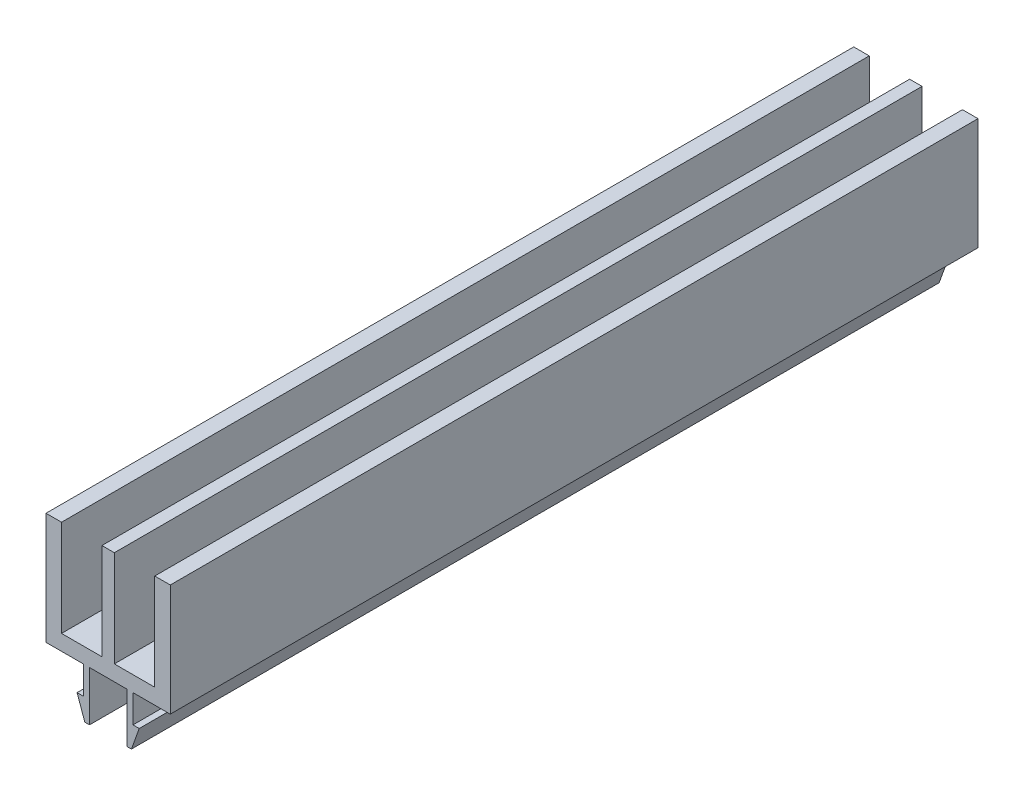
ISO-10303-21;
HEADER;
FILE_DESCRIPTION(('STEP AP214'),'2;1');
FILE_NAME('part.step','',(''),(''),'','','');
FILE_SCHEMA(('AUTOMOTIVE_DESIGN { 1 0 10303 214 1 1 1 1 }'));
ENDSEC;
DATA;
#1=APPLICATION_CONTEXT('core data for automotive mechanical design processes');
#2=APPLICATION_PROTOCOL_DEFINITION('international standard','automotive_design',2000,#1);
#3=PRODUCT_CONTEXT('',#1,'mechanical');
#4=PRODUCT('Part','Part','',(#3));
#5=PRODUCT_RELATED_PRODUCT_CATEGORY('part','',(#4));
#6=PRODUCT_DEFINITION_FORMATION('','',#4);
#7=PRODUCT_DEFINITION_CONTEXT('part definition',#1,'design');
#8=PRODUCT_DEFINITION('design','',#6,#7);
#9=PRODUCT_DEFINITION_SHAPE('','',#8);
#10=(LENGTH_UNIT() NAMED_UNIT(*) SI_UNIT(.MILLI.,.METRE.));
#11=(NAMED_UNIT(*) PLANE_ANGLE_UNIT() SI_UNIT($,.RADIAN.));
#12=(NAMED_UNIT(*) SI_UNIT($,.STERADIAN.) SOLID_ANGLE_UNIT());
#13=UNCERTAINTY_MEASURE_WITH_UNIT(LENGTH_MEASURE(1.E-05),#10,'distance_accuracy_value','');
#14=(GEOMETRIC_REPRESENTATION_CONTEXT(3) GLOBAL_UNCERTAINTY_ASSIGNED_CONTEXT((#13)) GLOBAL_UNIT_ASSIGNED_CONTEXT((#10,
#11,#12)) REPRESENTATION_CONTEXT('',''));
#15=CARTESIAN_POINT('',(0.,0.,0.));
#16=DIRECTION('',(0.,0.,1.));
#17=DIRECTION('',(1.,0.,0.));
#18=AXIS2_PLACEMENT_3D('',#15,#16,#17);
#19=CARTESIAN_POINT('',(-1.,17.9999999975,-80.));
#20=DIRECTION('',(-1.,0.,0.));
#21=DIRECTION('',(0.,-1.,0.));
#22=AXIS2_PLACEMENT_3D('',#19,#20,#21);
#23=PLANE('',#22);
#24=DIRECTION('',(0.,-1.,0.));
#25=VECTOR('',#24,1.);
#26=CARTESIAN_POINT('',(-1.,17.9999999975,50.));
#27=LINE('',#26,#25);
#28=CARTESIAN_POINT('',(-1.,17.9999999975,50.));
#29=VERTEX_POINT('',#28);
#30=CARTESIAN_POINT('',(-1.,2.4999999995,50.));
#31=VERTEX_POINT('',#30);
#32=EDGE_CURVE('E226',#29,#31,#27,.T.);
#33=ORIENTED_EDGE('',*,*,#32,.F.);
#34=DIRECTION('',(0.,0.,1.));
#35=VECTOR('',#34,1.);
#36=CARTESIAN_POINT('',(-1.,17.9999999975,-80.));
#37=LINE('',#36,#35);
#38=CARTESIAN_POINT('',(-1.,17.9999999975,-80.));
#39=VERTEX_POINT('',#38);
#40=EDGE_CURVE('E11',#39,#29,#37,.T.);
#41=ORIENTED_EDGE('',*,*,#40,.F.);
#42=DIRECTION('',(0.,-1.,0.));
#43=VECTOR('',#42,1.);
#44=CARTESIAN_POINT('',(-1.,17.9999999975,-80.));
#45=LINE('',#44,#43);
#46=CARTESIAN_POINT('',(-1.,2.4999999995,-80.));
#47=VERTEX_POINT('',#46);
#48=EDGE_CURVE('E294',#39,#47,#45,.T.);
#49=ORIENTED_EDGE('',*,*,#48,.T.);
#50=DIRECTION('',(0.,0.,1.));
#51=VECTOR('',#50,1.);
#52=CARTESIAN_POINT('',(-1.,2.4999999995,-80.));
#53=LINE('',#52,#51);
#54=EDGE_CURVE('E36',#47,#31,#53,.T.);
#55=ORIENTED_EDGE('',*,*,#54,.T.);
#56=EDGE_LOOP('',(#33,#41,#49,#55));
#57=FACE_BOUND('',#56,.T.);
#58=ADVANCED_FACE('F33',(#57),#23,.T.);
#59=CARTESIAN_POINT('',(0.999999999999998,17.9999999975,-80.));
#60=DIRECTION('',(0.,1.,0.));
#61=DIRECTION('',(0.,0.,1.));
#62=AXIS2_PLACEMENT_3D('',#59,#60,#61);
#63=PLANE('',#62);
#64=DIRECTION('',(-1.,0.,0.));
#65=VECTOR('',#64,1.);
#66=CARTESIAN_POINT('',(0.999999999999998,17.9999999975,50.));
#67=LINE('',#66,#65);
#68=CARTESIAN_POINT('',(0.999999999999998,17.9999999975,50.));
#69=VERTEX_POINT('',#68);
#70=EDGE_CURVE('E292',#69,#29,#67,.T.);
#71=ORIENTED_EDGE('',*,*,#70,.F.);
#72=DIRECTION('',(0.,0.,1.));
#73=VECTOR('',#72,1.);
#74=CARTESIAN_POINT('',(0.999999999999998,17.9999999975,-80.));
#75=LINE('',#74,#73);
#76=CARTESIAN_POINT('',(0.999999999999998,17.9999999975,-80.));
#77=VERTEX_POINT('',#76);
#78=EDGE_CURVE('E42',#77,#69,#75,.T.);
#79=ORIENTED_EDGE('',*,*,#78,.F.);
#80=DIRECTION('',(-1.,0.,0.));
#81=VECTOR('',#80,1.);
#82=CARTESIAN_POINT('',(0.999999999999998,17.9999999975,-80.));
#83=LINE('',#82,#81);
#84=EDGE_CURVE('E216',#77,#39,#83,.T.);
#85=ORIENTED_EDGE('',*,*,#84,.T.);
#86=ORIENTED_EDGE('',*,*,#40,.T.);
#87=EDGE_LOOP('',(#71,#79,#85,#86));
#88=FACE_BOUND('',#87,.T.);
#89=ADVANCED_FACE('F338',(#88),#63,.T.);
#90=CARTESIAN_POINT('',(0.999999999999998,2.4999999995,-80.));
#91=DIRECTION('',(1.,0.,0.));
#92=DIRECTION('',(0.,0.,-1.));
#93=AXIS2_PLACEMENT_3D('',#90,#91,#92);
#94=PLANE('',#93);
#95=DIRECTION('',(0.,1.,0.));
#96=VECTOR('',#95,1.);
#97=CARTESIAN_POINT('',(0.999999999999998,2.4999999995,50.));
#98=LINE('',#97,#96);
#99=CARTESIAN_POINT('',(0.999999999999998,2.4999999995,50.));
#100=VERTEX_POINT('',#99);
#101=EDGE_CURVE('E203',#100,#69,#98,.T.);
#102=ORIENTED_EDGE('',*,*,#101,.F.);
#103=DIRECTION('',(0.,0.,1.));
#104=VECTOR('',#103,1.);
#105=CARTESIAN_POINT('',(0.999999999999998,2.4999999995,-80.));
#106=LINE('',#105,#104);
#107=CARTESIAN_POINT('',(0.999999999999998,2.4999999995,-80.));
#108=VERTEX_POINT('',#107);
#109=EDGE_CURVE('E198',#108,#100,#106,.T.);
#110=ORIENTED_EDGE('',*,*,#109,.F.);
#111=DIRECTION('',(0.,1.,0.));
#112=VECTOR('',#111,1.);
#113=CARTESIAN_POINT('',(0.999999999999998,2.4999999995,-80.));
#114=LINE('',#113,#112);
#115=EDGE_CURVE('E201',#108,#77,#114,.T.);
#116=ORIENTED_EDGE('',*,*,#115,.T.);
#117=ORIENTED_EDGE('',*,*,#78,.T.);
#118=EDGE_LOOP('',(#102,#110,#116,#117));
#119=FACE_BOUND('',#118,.T.);
#120=ADVANCED_FACE('F200',(#119),#94,.T.);
#121=CARTESIAN_POINT('',(7.5,2.4999999995,-80.));
#122=DIRECTION('',(0.,1.,0.));
#123=DIRECTION('',(-1.,0.,0.));
#124=AXIS2_PLACEMENT_3D('',#121,#122,#123);
#125=PLANE('',#124);
#126=DIRECTION('',(-1.,0.,0.));
#127=VECTOR('',#126,1.);
#128=CARTESIAN_POINT('',(7.5,2.4999999995,50.));
#129=LINE('',#128,#127);
#130=CARTESIAN_POINT('',(7.5,2.4999999995,50.));
#131=VERTEX_POINT('',#130);
#132=EDGE_CURVE('E289',#131,#100,#129,.T.);
#133=ORIENTED_EDGE('',*,*,#132,.F.);
#134=DIRECTION('',(0.,0.,1.));
#135=VECTOR('',#134,1.);
#136=CARTESIAN_POINT('',(7.5,2.4999999995,-80.));
#137=LINE('',#136,#135);
#138=CARTESIAN_POINT('',(7.5,2.4999999995,-80.));
#139=VERTEX_POINT('',#138);
#140=EDGE_CURVE('E208',#139,#131,#137,.T.);
#141=ORIENTED_EDGE('',*,*,#140,.F.);
#142=DIRECTION('',(-1.,0.,0.));
#143=VECTOR('',#142,1.);
#144=CARTESIAN_POINT('',(7.5,2.4999999995,-80.));
#145=LINE('',#144,#143);
#146=EDGE_CURVE('E214',#139,#108,#145,.T.);
#147=ORIENTED_EDGE('',*,*,#146,.T.);
#148=ORIENTED_EDGE('',*,*,#109,.T.);
#149=EDGE_LOOP('',(#133,#141,#147,#148));
#150=FACE_BOUND('',#149,.T.);
#151=ADVANCED_FACE('F218',(#150),#125,.T.);
#152=CARTESIAN_POINT('',(7.5,17.9999999975,-80.));
#153=DIRECTION('',(-1.,0.,0.));
#154=DIRECTION('',(0.,-1.,0.));
#155=AXIS2_PLACEMENT_3D('',#152,#153,#154);
#156=PLANE('',#155);
#157=DIRECTION('',(0.,-1.,0.));
#158=VECTOR('',#157,1.);
#159=CARTESIAN_POINT('',(7.5,17.9999999975,50.));
#160=LINE('',#159,#158);
#161=CARTESIAN_POINT('',(7.5,17.9999999975,50.));
#162=VERTEX_POINT('',#161);
#163=EDGE_CURVE('E286',#162,#131,#160,.T.);
#164=ORIENTED_EDGE('',*,*,#163,.F.);
#165=DIRECTION('',(0.,0.,1.));
#166=VECTOR('',#165,1.);
#167=CARTESIAN_POINT('',(7.5,17.9999999975,-80.));
#168=LINE('',#167,#166);
#169=CARTESIAN_POINT('',(7.5,17.9999999975,-80.));
#170=VERTEX_POINT('',#169);
#171=EDGE_CURVE('E298',#170,#162,#168,.T.);
#172=ORIENTED_EDGE('',*,*,#171,.F.);
#173=DIRECTION('',(0.,-1.,0.));
#174=VECTOR('',#173,1.);
#175=CARTESIAN_POINT('',(7.5,17.9999999975,-80.));
#176=LINE('',#175,#174);
#177=EDGE_CURVE('E219',#170,#139,#176,.T.);
#178=ORIENTED_EDGE('',*,*,#177,.T.);
#179=ORIENTED_EDGE('',*,*,#140,.T.);
#180=EDGE_LOOP('',(#164,#172,#178,#179));
#181=FACE_BOUND('',#180,.T.);
#182=ADVANCED_FACE('F351',(#181),#156,.T.);
#183=CARTESIAN_POINT('',(10.,17.9999999975,-80.));
#184=DIRECTION('',(0.,1.,0.));
#185=DIRECTION('',(0.,0.,1.));
#186=AXIS2_PLACEMENT_3D('',#183,#184,#185);
#187=PLANE('',#186);
#188=DIRECTION('',(-1.,0.,0.));
#189=VECTOR('',#188,1.);
#190=CARTESIAN_POINT('',(10.,17.9999999975,50.));
#191=LINE('',#190,#189);
#192=CARTESIAN_POINT('',(10.,17.9999999975,50.));
#193=VERTEX_POINT('',#192);
#194=EDGE_CURVE('E283',#193,#162,#191,.T.);
#195=ORIENTED_EDGE('',*,*,#194,.F.);
#196=DIRECTION('',(0.,0.,1.));
#197=VECTOR('',#196,1.);
#198=CARTESIAN_POINT('',(10.,17.9999999975,-80.));
#199=LINE('',#198,#197);
#200=CARTESIAN_POINT('',(10.,17.9999999975,-80.));
#201=VERTEX_POINT('',#200);
#202=EDGE_CURVE('E300',#201,#193,#199,.T.);
#203=ORIENTED_EDGE('',*,*,#202,.F.);
#204=DIRECTION('',(-1.,0.,0.));
#205=VECTOR('',#204,1.);
#206=CARTESIAN_POINT('',(10.,17.9999999975,-80.));
#207=LINE('',#206,#205);
#208=EDGE_CURVE('E221',#201,#170,#207,.T.);
#209=ORIENTED_EDGE('',*,*,#208,.T.);
#210=ORIENTED_EDGE('',*,*,#171,.T.);
#211=EDGE_LOOP('',(#195,#203,#209,#210));
#212=FACE_BOUND('',#211,.T.);
#213=ADVANCED_FACE('F354',(#212),#187,.T.);
#214=CARTESIAN_POINT('',(10.,-4.99999828349541E-10,-80.));
#215=DIRECTION('',(1.,0.,0.));
#216=DIRECTION('',(0.,0.,-1.));
#217=AXIS2_PLACEMENT_3D('',#214,#215,#216);
#218=PLANE('',#217);
#219=DIRECTION('',(0.,1.,0.));
#220=VECTOR('',#219,1.);
#221=CARTESIAN_POINT('',(10.,-4.99999828349541E-10,50.));
#222=LINE('',#221,#220);
#223=CARTESIAN_POINT('',(10.,-4.99999828349541E-10,50.));
#224=VERTEX_POINT('',#223);
#225=EDGE_CURVE('E280',#224,#193,#222,.T.);
#226=ORIENTED_EDGE('',*,*,#225,.F.);
#227=DIRECTION('',(0.,0.,1.));
#228=VECTOR('',#227,1.);
#229=CARTESIAN_POINT('',(10.,-4.99999828349541E-10,-80.));
#230=LINE('',#229,#228);
#231=CARTESIAN_POINT('',(10.,-4.99999828349541E-10,-80.));
#232=VERTEX_POINT('',#231);
#233=EDGE_CURVE('E302',#232,#224,#230,.T.);
#234=ORIENTED_EDGE('',*,*,#233,.F.);
#235=DIRECTION('',(0.,1.,0.));
#236=VECTOR('',#235,1.);
#237=CARTESIAN_POINT('',(10.,-4.99999828349541E-10,-80.));
#238=LINE('',#237,#236);
#239=EDGE_CURVE('E644',#232,#201,#238,.T.);
#240=ORIENTED_EDGE('',*,*,#239,.T.);
#241=ORIENTED_EDGE('',*,*,#202,.T.);
#242=EDGE_LOOP('',(#226,#234,#240,#241));
#243=FACE_BOUND('',#242,.T.);
#244=ADVANCED_FACE('F358',(#243),#218,.T.);
#245=CARTESIAN_POINT('',(4.,-4.99999998002099E-10,-80.));
#246=DIRECTION('',(0.,-1.,0.));
#247=DIRECTION('',(1.,0.,0.));
#248=AXIS2_PLACEMENT_3D('',#245,#246,#247);
#249=PLANE('',#248);
#250=DIRECTION('',(1.,0.,0.));
#251=VECTOR('',#250,1.);
#252=CARTESIAN_POINT('',(4.,-4.99999998002099E-10,50.));
#253=LINE('',#252,#251);
#254=CARTESIAN_POINT('',(4.,-4.99999998002099E-10,50.));
#255=VERTEX_POINT('',#254);
#256=EDGE_CURVE('E277',#255,#224,#253,.T.);
#257=ORIENTED_EDGE('',*,*,#256,.F.);
#258=DIRECTION('',(0.,0.,1.));
#259=VECTOR('',#258,1.);
#260=CARTESIAN_POINT('',(4.,-4.99999998002099E-10,-80.));
#261=LINE('',#260,#259);
#262=CARTESIAN_POINT('',(4.,-4.99999998002099E-10,-80.));
#263=VERTEX_POINT('',#262);
#264=EDGE_CURVE('E304',#263,#255,#261,.T.);
#265=ORIENTED_EDGE('',*,*,#264,.F.);
#266=DIRECTION('',(1.,0.,0.));
#267=VECTOR('',#266,1.);
#268=CARTESIAN_POINT('',(4.,-4.99999998002099E-10,-80.));
#269=LINE('',#268,#267);
#270=EDGE_CURVE('E648',#263,#232,#269,.T.);
#271=ORIENTED_EDGE('',*,*,#270,.T.);
#272=ORIENTED_EDGE('',*,*,#233,.T.);
#273=EDGE_LOOP('',(#257,#265,#271,#272));
#274=FACE_BOUND('',#273,.T.);
#275=ADVANCED_FACE('F362',(#274),#249,.T.);
#276=CARTESIAN_POINT('',(4.,-4.5,-80.));
#277=DIRECTION('',(1.,0.,0.));
#278=DIRECTION('',(0.,0.,-1.));
#279=AXIS2_PLACEMENT_3D('',#276,#277,#278);
#280=PLANE('',#279);
#281=DIRECTION('',(0.,1.,0.));
#282=VECTOR('',#281,1.);
#283=CARTESIAN_POINT('',(4.,-4.5,50.));
#284=LINE('',#283,#282);
#285=CARTESIAN_POINT('',(4.,-4.5,50.));
#286=VERTEX_POINT('',#285);
#287=EDGE_CURVE('E274',#286,#255,#284,.T.);
#288=ORIENTED_EDGE('',*,*,#287,.F.);
#289=DIRECTION('',(0.,0.,1.));
#290=VECTOR('',#289,1.);
#291=CARTESIAN_POINT('',(4.,-4.5,-80.));
#292=LINE('',#291,#290);
#293=CARTESIAN_POINT('',(4.,-4.5,-80.));
#294=VERTEX_POINT('',#293);
#295=EDGE_CURVE('E306',#294,#286,#292,.T.);
#296=ORIENTED_EDGE('',*,*,#295,.F.);
#297=DIRECTION('',(0.,1.,0.));
#298=VECTOR('',#297,1.);
#299=CARTESIAN_POINT('',(4.,-4.5,-80.));
#300=LINE('',#299,#298);
#301=EDGE_CURVE('E637',#294,#263,#300,.T.);
#302=ORIENTED_EDGE('',*,*,#301,.T.);
#303=ORIENTED_EDGE('',*,*,#264,.T.);
#304=EDGE_LOOP('',(#288,#296,#302,#303));
#305=FACE_BOUND('',#304,.T.);
#306=ADVANCED_FACE('F366',(#305),#280,.T.);
#307=CARTESIAN_POINT('',(5.,-4.5,-80.));
#308=DIRECTION('',(0.,1.,0.));
#309=DIRECTION('',(0.,0.,1.));
#310=AXIS2_PLACEMENT_3D('',#307,#308,#309);
#311=PLANE('',#310);
#312=DIRECTION('',(-1.,0.,0.));
#313=VECTOR('',#312,1.);
#314=CARTESIAN_POINT('',(5.,-4.5,50.));
#315=LINE('',#314,#313);
#316=CARTESIAN_POINT('',(5.,-4.5,50.));
#317=VERTEX_POINT('',#316);
#318=EDGE_CURVE('E271',#317,#286,#315,.T.);
#319=ORIENTED_EDGE('',*,*,#318,.F.);
#320=DIRECTION('',(0.,0.,1.));
#321=VECTOR('',#320,1.);
#322=CARTESIAN_POINT('',(5.,-4.5,-80.));
#323=LINE('',#322,#321);
#324=CARTESIAN_POINT('',(5.,-4.5,-80.));
#325=VERTEX_POINT('',#324);
#326=EDGE_CURVE('E308',#325,#317,#323,.T.);
#327=ORIENTED_EDGE('',*,*,#326,.F.);
#328=DIRECTION('',(-1.,0.,0.));
#329=VECTOR('',#328,1.);
#330=CARTESIAN_POINT('',(5.,-4.5,-80.));
#331=LINE('',#330,#329);
#332=EDGE_CURVE('E633',#325,#294,#331,.T.);
#333=ORIENTED_EDGE('',*,*,#332,.T.);
#334=ORIENTED_EDGE('',*,*,#295,.T.);
#335=EDGE_LOOP('',(#319,#327,#333,#334));
#336=FACE_BOUND('',#335,.T.);
#337=ADVANCED_FACE('F370',(#336),#311,.T.);
#338=CARTESIAN_POINT('',(3.75,-8.,-80.));
#339=DIRECTION('',(0.941741911594837,-0.336336396998156,0.));
#340=DIRECTION('',(0.336336396998157,0.941741911594838,0.));
#341=AXIS2_PLACEMENT_3D('',#338,#339,#340);
#342=PLANE('',#341);
#343=DIRECTION('',(0.336336396998157,0.941741911594837,0.));
#344=VECTOR('',#343,1.);
#345=CARTESIAN_POINT('',(3.75,-8.,50.));
#346=LINE('',#345,#344);
#347=CARTESIAN_POINT('',(3.75,-8.,50.));
#348=VERTEX_POINT('',#347);
#349=EDGE_CURVE('E268',#348,#317,#346,.T.);
#350=ORIENTED_EDGE('',*,*,#349,.F.);
#351=DIRECTION('',(0.,0.,1.));
#352=VECTOR('',#351,1.);
#353=CARTESIAN_POINT('',(3.75,-8.,-80.));
#354=LINE('',#353,#352);
#355=CARTESIAN_POINT('',(3.75,-8.,-80.));
#356=VERTEX_POINT('',#355);
#357=EDGE_CURVE('E310',#356,#348,#354,.T.);
#358=ORIENTED_EDGE('',*,*,#357,.F.);
#359=DIRECTION('',(0.336336396998157,0.941741911594837,0.));
#360=VECTOR('',#359,1.);
#361=CARTESIAN_POINT('',(3.75,-8.,-80.));
#362=LINE('',#361,#360);
#363=EDGE_CURVE('E654',#356,#325,#362,.T.);
#364=ORIENTED_EDGE('',*,*,#363,.T.);
#365=ORIENTED_EDGE('',*,*,#326,.T.);
#366=EDGE_LOOP('',(#350,#358,#364,#365));
#367=FACE_BOUND('',#366,.T.);
#368=ADVANCED_FACE('F374',(#367),#342,.T.);
#369=CARTESIAN_POINT('',(3.,-8.,-80.));
#370=DIRECTION('',(0.,-1.,0.));
#371=DIRECTION('',(0.,0.,-1.));
#372=AXIS2_PLACEMENT_3D('',#369,#370,#371);
#373=PLANE('',#372);
#374=DIRECTION('',(1.,0.,0.));
#375=VECTOR('',#374,1.);
#376=CARTESIAN_POINT('',(3.,-8.,50.));
#377=LINE('',#376,#375);
#378=CARTESIAN_POINT('',(3.,-8.,50.));
#379=VERTEX_POINT('',#378);
#380=EDGE_CURVE('E265',#379,#348,#377,.T.);
#381=ORIENTED_EDGE('',*,*,#380,.F.);
#382=DIRECTION('',(0.,0.,1.));
#383=VECTOR('',#382,1.);
#384=CARTESIAN_POINT('',(3.,-8.,-80.));
#385=LINE('',#384,#383);
#386=CARTESIAN_POINT('',(3.,-8.,-80.));
#387=VERTEX_POINT('',#386);
#388=EDGE_CURVE('E312',#387,#379,#385,.T.);
#389=ORIENTED_EDGE('',*,*,#388,.F.);
#390=DIRECTION('',(1.,0.,0.));
#391=VECTOR('',#390,1.);
#392=CARTESIAN_POINT('',(3.,-8.,-80.));
#393=LINE('',#392,#391);
#394=EDGE_CURVE('E626',#387,#356,#393,.T.);
#395=ORIENTED_EDGE('',*,*,#394,.T.);
#396=ORIENTED_EDGE('',*,*,#357,.T.);
#397=EDGE_LOOP('',(#381,#389,#395,#396));
#398=FACE_BOUND('',#397,.T.);
#399=ADVANCED_FACE('F378',(#398),#373,.T.);
#400=CARTESIAN_POINT('',(3.,-4.9999985194348E-10,-80.));
#401=DIRECTION('',(-1.,0.,0.));
#402=DIRECTION('',(0.,0.,1.));
#403=AXIS2_PLACEMENT_3D('',#400,#401,#402);
#404=PLANE('',#403);
#405=DIRECTION('',(0.,-1.,0.));
#406=VECTOR('',#405,1.);
#407=CARTESIAN_POINT('',(3.,-4.9999985194348E-10,50.));
#408=LINE('',#407,#406);
#409=CARTESIAN_POINT('',(3.,-4.9999985194348E-10,50.));
#410=VERTEX_POINT('',#409);
#411=EDGE_CURVE('E262',#410,#379,#408,.T.);
#412=ORIENTED_EDGE('',*,*,#411,.F.);
#413=DIRECTION('',(0.,0.,1.));
#414=VECTOR('',#413,1.);
#415=CARTESIAN_POINT('',(3.,-4.9999985194348E-10,-80.));
#416=LINE('',#415,#414);
#417=CARTESIAN_POINT('',(3.,-4.9999985194348E-10,-80.));
#418=VERTEX_POINT('',#417);
#419=EDGE_CURVE('E314',#418,#410,#416,.T.);
#420=ORIENTED_EDGE('',*,*,#419,.F.);
#421=DIRECTION('',(0.,-1.,0.));
#422=VECTOR('',#421,1.);
#423=CARTESIAN_POINT('',(3.,-4.9999985194348E-10,-80.));
#424=LINE('',#423,#422);
#425=EDGE_CURVE('E622',#418,#387,#424,.T.);
#426=ORIENTED_EDGE('',*,*,#425,.T.);
#427=ORIENTED_EDGE('',*,*,#388,.T.);
#428=EDGE_LOOP('',(#412,#420,#426,#427));
#429=FACE_BOUND('',#428,.T.);
#430=ADVANCED_FACE('F382',(#429),#404,.T.);
#431=CARTESIAN_POINT('',(-3.,-4.99999455901012E-10,-80.));
#432=DIRECTION('',(0.,-1.,0.));
#433=DIRECTION('',(1.,0.,0.));
#434=AXIS2_PLACEMENT_3D('',#431,#432,#433);
#435=PLANE('',#434);
#436=DIRECTION('',(1.,0.,0.));
#437=VECTOR('',#436,1.);
#438=CARTESIAN_POINT('',(-3.,-4.99999455901012E-10,50.));
#439=LINE('',#438,#437);
#440=CARTESIAN_POINT('',(-3.,-4.99999455901012E-10,50.));
#441=VERTEX_POINT('',#440);
#442=EDGE_CURVE('E259',#441,#410,#439,.T.);
#443=ORIENTED_EDGE('',*,*,#442,.F.);
#444=DIRECTION('',(0.,0.,1.));
#445=VECTOR('',#444,1.);
#446=CARTESIAN_POINT('',(-3.,-4.99999455901012E-10,-80.));
#447=LINE('',#446,#445);
#448=CARTESIAN_POINT('',(-3.,-4.99999455901012E-10,-80.));
#449=VERTEX_POINT('',#448);
#450=EDGE_CURVE('E316',#449,#441,#447,.T.);
#451=ORIENTED_EDGE('',*,*,#450,.F.);
#452=DIRECTION('',(1.,0.,0.));
#453=VECTOR('',#452,1.);
#454=CARTESIAN_POINT('',(-3.,-4.99999455901012E-10,-80.));
#455=LINE('',#454,#453);
#456=EDGE_CURVE('E658',#449,#418,#455,.T.);
#457=ORIENTED_EDGE('',*,*,#456,.T.);
#458=ORIENTED_EDGE('',*,*,#419,.T.);
#459=EDGE_LOOP('',(#443,#451,#457,#458));
#460=FACE_BOUND('',#459,.T.);
#461=ADVANCED_FACE('F386',(#460),#435,.T.);
#462=CARTESIAN_POINT('',(-3.,-8.,-80.));
#463=DIRECTION('',(1.,0.,0.));
#464=DIRECTION('',(0.,0.,-1.));
#465=AXIS2_PLACEMENT_3D('',#462,#463,#464);
#466=PLANE('',#465);
#467=DIRECTION('',(0.,1.,0.));
#468=VECTOR('',#467,1.);
#469=CARTESIAN_POINT('',(-3.,-8.,50.));
#470=LINE('',#469,#468);
#471=CARTESIAN_POINT('',(-3.,-8.,50.));
#472=VERTEX_POINT('',#471);
#473=EDGE_CURVE('E256',#472,#441,#470,.T.);
#474=ORIENTED_EDGE('',*,*,#473,.F.);
#475=DIRECTION('',(0.,0.,1.));
#476=VECTOR('',#475,1.);
#477=CARTESIAN_POINT('',(-3.,-8.,-80.));
#478=LINE('',#477,#476);
#479=CARTESIAN_POINT('',(-3.,-8.,-80.));
#480=VERTEX_POINT('',#479);
#481=EDGE_CURVE('E318',#480,#472,#478,.T.);
#482=ORIENTED_EDGE('',*,*,#481,.F.);
#483=DIRECTION('',(0.,1.,0.));
#484=VECTOR('',#483,1.);
#485=CARTESIAN_POINT('',(-3.,-8.,-80.));
#486=LINE('',#485,#484);
#487=EDGE_CURVE('E615',#480,#449,#486,.T.);
#488=ORIENTED_EDGE('',*,*,#487,.T.);
#489=ORIENTED_EDGE('',*,*,#450,.T.);
#490=EDGE_LOOP('',(#474,#482,#488,#489));
#491=FACE_BOUND('',#490,.T.);
#492=ADVANCED_FACE('F390',(#491),#466,.T.);
#493=CARTESIAN_POINT('',(-3.75,-8.,-80.));
#494=DIRECTION('',(0.,-1.,0.));
#495=DIRECTION('',(0.,0.,-1.));
#496=AXIS2_PLACEMENT_3D('',#493,#494,#495);
#497=PLANE('',#496);
#498=DIRECTION('',(1.,0.,0.));
#499=VECTOR('',#498,1.);
#500=CARTESIAN_POINT('',(-3.75,-8.,50.));
#501=LINE('',#500,#499);
#502=CARTESIAN_POINT('',(-3.75,-8.,50.));
#503=VERTEX_POINT('',#502);
#504=EDGE_CURVE('E253',#503,#472,#501,.T.);
#505=ORIENTED_EDGE('',*,*,#504,.F.);
#506=DIRECTION('',(0.,0.,1.));
#507=VECTOR('',#506,1.);
#508=CARTESIAN_POINT('',(-3.75,-8.,-80.));
#509=LINE('',#508,#507);
#510=CARTESIAN_POINT('',(-3.75,-8.,-80.));
#511=VERTEX_POINT('',#510);
#512=EDGE_CURVE('E320',#511,#503,#509,.T.);
#513=ORIENTED_EDGE('',*,*,#512,.F.);
#514=DIRECTION('',(1.,0.,0.));
#515=VECTOR('',#514,1.);
#516=CARTESIAN_POINT('',(-3.75,-8.,-80.));
#517=LINE('',#516,#515);
#518=EDGE_CURVE('E611',#511,#480,#517,.T.);
#519=ORIENTED_EDGE('',*,*,#518,.T.);
#520=ORIENTED_EDGE('',*,*,#481,.T.);
#521=EDGE_LOOP('',(#505,#513,#519,#520));
#522=FACE_BOUND('',#521,.T.);
#523=ADVANCED_FACE('F394',(#522),#497,.T.);
#524=CARTESIAN_POINT('',(-5.,-4.5,-80.));
#525=DIRECTION('',(-0.941741911594837,-0.336336396998156,0.));
#526=DIRECTION('',(0.336336396998156,-0.941741911594837,0.));
#527=AXIS2_PLACEMENT_3D('',#524,#525,#526);
#528=PLANE('',#527);
#529=DIRECTION('',(0.336336396998156,-0.941741911594837,0.));
#530=VECTOR('',#529,1.);
#531=CARTESIAN_POINT('',(-5.,-4.5,50.));
#532=LINE('',#531,#530);
#533=CARTESIAN_POINT('',(-5.,-4.5,50.));
#534=VERTEX_POINT('',#533);
#535=EDGE_CURVE('E250',#534,#503,#532,.T.);
#536=ORIENTED_EDGE('',*,*,#535,.F.);
#537=DIRECTION('',(0.,0.,1.));
#538=VECTOR('',#537,1.);
#539=CARTESIAN_POINT('',(-5.,-4.5,-80.));
#540=LINE('',#539,#538);
#541=CARTESIAN_POINT('',(-5.,-4.5,-80.));
#542=VERTEX_POINT('',#541);
#543=EDGE_CURVE('E322',#542,#534,#540,.T.);
#544=ORIENTED_EDGE('',*,*,#543,.F.);
#545=DIRECTION('',(0.336336396998156,-0.941741911594837,0.));
#546=VECTOR('',#545,1.);
#547=CARTESIAN_POINT('',(-5.,-4.5,-80.));
#548=LINE('',#547,#546);
#549=EDGE_CURVE('E662',#542,#511,#548,.T.);
#550=ORIENTED_EDGE('',*,*,#549,.T.);
#551=ORIENTED_EDGE('',*,*,#512,.T.);
#552=EDGE_LOOP('',(#536,#544,#550,#551));
#553=FACE_BOUND('',#552,.T.);
#554=ADVANCED_FACE('F398',(#553),#528,.T.);
#555=CARTESIAN_POINT('',(-4.,-4.5,-80.));
#556=DIRECTION('',(0.,1.,0.));
#557=DIRECTION('',(0.,0.,1.));
#558=AXIS2_PLACEMENT_3D('',#555,#556,#557);
#559=PLANE('',#558);
#560=DIRECTION('',(-1.,0.,0.));
#561=VECTOR('',#560,1.);
#562=CARTESIAN_POINT('',(-4.,-4.5,50.));
#563=LINE('',#562,#561);
#564=CARTESIAN_POINT('',(-4.,-4.5,50.));
#565=VERTEX_POINT('',#564);
#566=EDGE_CURVE('E247',#565,#534,#563,.T.);
#567=ORIENTED_EDGE('',*,*,#566,.F.);
#568=DIRECTION('',(0.,0.,1.));
#569=VECTOR('',#568,1.);
#570=CARTESIAN_POINT('',(-4.,-4.5,-80.));
#571=LINE('',#570,#569);
#572=CARTESIAN_POINT('',(-4.,-4.5,-80.));
#573=VERTEX_POINT('',#572);
#574=EDGE_CURVE('E324',#573,#565,#571,.T.);
#575=ORIENTED_EDGE('',*,*,#574,.F.);
#576=DIRECTION('',(-1.,0.,0.));
#577=VECTOR('',#576,1.);
#578=CARTESIAN_POINT('',(-4.,-4.5,-80.));
#579=LINE('',#578,#577);
#580=EDGE_CURVE('E604',#573,#542,#579,.T.);
#581=ORIENTED_EDGE('',*,*,#580,.T.);
#582=ORIENTED_EDGE('',*,*,#543,.T.);
#583=EDGE_LOOP('',(#567,#575,#581,#582));
#584=FACE_BOUND('',#583,.T.);
#585=ADVANCED_FACE('F402',(#584),#559,.T.);
#586=CARTESIAN_POINT('',(-4.,-4.9999985194348E-10,-80.));
#587=DIRECTION('',(-1.,0.,0.));
#588=DIRECTION('',(0.,0.,1.));
#589=AXIS2_PLACEMENT_3D('',#586,#587,#588);
#590=PLANE('',#589);
#591=DIRECTION('',(0.,-1.,0.));
#592=VECTOR('',#591,1.);
#593=CARTESIAN_POINT('',(-4.,-4.9999985194348E-10,50.));
#594=LINE('',#593,#592);
#595=CARTESIAN_POINT('',(-4.,-4.9999985194348E-10,50.));
#596=VERTEX_POINT('',#595);
#597=EDGE_CURVE('E244',#596,#565,#594,.T.);
#598=ORIENTED_EDGE('',*,*,#597,.F.);
#599=DIRECTION('',(0.,0.,1.));
#600=VECTOR('',#599,1.);
#601=CARTESIAN_POINT('',(-4.,-4.9999985194348E-10,-80.));
#602=LINE('',#601,#600);
#603=CARTESIAN_POINT('',(-4.,-4.9999985194348E-10,-80.));
#604=VERTEX_POINT('',#603);
#605=EDGE_CURVE('E326',#604,#596,#602,.T.);
#606=ORIENTED_EDGE('',*,*,#605,.F.);
#607=DIRECTION('',(0.,-1.,0.));
#608=VECTOR('',#607,1.);
#609=CARTESIAN_POINT('',(-4.,-4.9999985194348E-10,-80.));
#610=LINE('',#609,#608);
#611=EDGE_CURVE('E600',#604,#573,#610,.T.);
#612=ORIENTED_EDGE('',*,*,#611,.T.);
#613=ORIENTED_EDGE('',*,*,#574,.T.);
#614=EDGE_LOOP('',(#598,#606,#612,#613));
#615=FACE_BOUND('',#614,.T.);
#616=ADVANCED_FACE('F406',(#615),#590,.T.);
#617=CARTESIAN_POINT('',(-10.,-4.99999719929324E-10,-80.));
#618=DIRECTION('',(0.,-1.,0.));
#619=DIRECTION('',(1.,0.,0.));
#620=AXIS2_PLACEMENT_3D('',#617,#618,#619);
#621=PLANE('',#620);
#622=DIRECTION('',(1.,0.,0.));
#623=VECTOR('',#622,1.);
#624=CARTESIAN_POINT('',(-10.,-4.99999719929324E-10,50.));
#625=LINE('',#624,#623);
#626=CARTESIAN_POINT('',(-10.,-4.99999719929324E-10,50.));
#627=VERTEX_POINT('',#626);
#628=EDGE_CURVE('E241',#627,#596,#625,.T.);
#629=ORIENTED_EDGE('',*,*,#628,.F.);
#630=DIRECTION('',(0.,0.,1.));
#631=VECTOR('',#630,1.);
#632=CARTESIAN_POINT('',(-10.,-4.99999719929324E-10,-80.));
#633=LINE('',#632,#631);
#634=CARTESIAN_POINT('',(-10.,-4.99999719929324E-10,-80.));
#635=VERTEX_POINT('',#634);
#636=EDGE_CURVE('E328',#635,#627,#633,.T.);
#637=ORIENTED_EDGE('',*,*,#636,.F.);
#638=DIRECTION('',(1.,0.,0.));
#639=VECTOR('',#638,1.);
#640=CARTESIAN_POINT('',(-10.,-4.99999719929324E-10,-80.));
#641=LINE('',#640,#639);
#642=EDGE_CURVE('E666',#635,#604,#641,.T.);
#643=ORIENTED_EDGE('',*,*,#642,.T.);
#644=ORIENTED_EDGE('',*,*,#605,.T.);
#645=EDGE_LOOP('',(#629,#637,#643,#644));
#646=FACE_BOUND('',#645,.T.);
#647=ADVANCED_FACE('F410',(#646),#621,.T.);
#648=CARTESIAN_POINT('',(-10.,17.9999999975,-80.));
#649=DIRECTION('',(-1.,0.,0.));
#650=DIRECTION('',(0.,-1.,0.));
#651=AXIS2_PLACEMENT_3D('',#648,#649,#650);
#652=PLANE('',#651);
#653=DIRECTION('',(0.,-1.,0.));
#654=VECTOR('',#653,1.);
#655=CARTESIAN_POINT('',(-10.,17.9999999975,50.));
#656=LINE('',#655,#654);
#657=CARTESIAN_POINT('',(-10.,17.9999999975,50.));
#658=VERTEX_POINT('',#657);
#659=EDGE_CURVE('E238',#658,#627,#656,.T.);
#660=ORIENTED_EDGE('',*,*,#659,.F.);
#661=DIRECTION('',(0.,0.,1.));
#662=VECTOR('',#661,1.);
#663=CARTESIAN_POINT('',(-10.,17.9999999975,-80.));
#664=LINE('',#663,#662);
#665=CARTESIAN_POINT('',(-10.,17.9999999975,-80.));
#666=VERTEX_POINT('',#665);
#667=EDGE_CURVE('E330',#666,#658,#664,.T.);
#668=ORIENTED_EDGE('',*,*,#667,.F.);
#669=DIRECTION('',(0.,-1.,0.));
#670=VECTOR('',#669,1.);
#671=CARTESIAN_POINT('',(-10.,17.9999999975,-80.));
#672=LINE('',#671,#670);
#673=EDGE_CURVE('E593',#666,#635,#672,.T.);
#674=ORIENTED_EDGE('',*,*,#673,.T.);
#675=ORIENTED_EDGE('',*,*,#636,.T.);
#676=EDGE_LOOP('',(#660,#668,#674,#675));
#677=FACE_BOUND('',#676,.T.);
#678=ADVANCED_FACE('F414',(#677),#652,.T.);
#679=CARTESIAN_POINT('',(-7.5,17.9999999975,-80.));
#680=DIRECTION('',(0.,1.,0.));
#681=DIRECTION('',(0.,0.,1.));
#682=AXIS2_PLACEMENT_3D('',#679,#680,#681);
#683=PLANE('',#682);
#684=DIRECTION('',(-1.,0.,0.));
#685=VECTOR('',#684,1.);
#686=CARTESIAN_POINT('',(-7.5,17.9999999975,50.));
#687=LINE('',#686,#685);
#688=CARTESIAN_POINT('',(-7.5,17.9999999975,50.));
#689=VERTEX_POINT('',#688);
#690=EDGE_CURVE('E235',#689,#658,#687,.T.);
#691=ORIENTED_EDGE('',*,*,#690,.F.);
#692=DIRECTION('',(0.,0.,1.));
#693=VECTOR('',#692,1.);
#694=CARTESIAN_POINT('',(-7.5,17.9999999975,-80.));
#695=LINE('',#694,#693);
#696=CARTESIAN_POINT('',(-7.5,17.9999999975,-80.));
#697=VERTEX_POINT('',#696);
#698=EDGE_CURVE('E332',#697,#689,#695,.T.);
#699=ORIENTED_EDGE('',*,*,#698,.F.);
#700=DIRECTION('',(-1.,0.,0.));
#701=VECTOR('',#700,1.);
#702=CARTESIAN_POINT('',(-7.5,17.9999999975,-80.));
#703=LINE('',#702,#701);
#704=EDGE_CURVE('E589',#697,#666,#703,.T.);
#705=ORIENTED_EDGE('',*,*,#704,.T.);
#706=ORIENTED_EDGE('',*,*,#667,.T.);
#707=EDGE_LOOP('',(#691,#699,#705,#706));
#708=FACE_BOUND('',#707,.T.);
#709=ADVANCED_FACE('F418',(#708),#683,.T.);
#710=CARTESIAN_POINT('',(-7.5,2.4999999995,-80.));
#711=DIRECTION('',(1.,0.,0.));
#712=DIRECTION('',(0.,0.,-1.));
#713=AXIS2_PLACEMENT_3D('',#710,#711,#712);
#714=PLANE('',#713);
#715=DIRECTION('',(0.,1.,0.));
#716=VECTOR('',#715,1.);
#717=CARTESIAN_POINT('',(-7.5,2.4999999995,50.));
#718=LINE('',#717,#716);
#719=CARTESIAN_POINT('',(-7.5,2.4999999995,50.));
#720=VERTEX_POINT('',#719);
#721=EDGE_CURVE('E232',#720,#689,#718,.T.);
#722=ORIENTED_EDGE('',*,*,#721,.F.);
#723=DIRECTION('',(0.,0.,1.));
#724=VECTOR('',#723,1.);
#725=CARTESIAN_POINT('',(-7.5,2.4999999995,-80.));
#726=LINE('',#725,#724);
#727=CARTESIAN_POINT('',(-7.5,2.4999999995,-80.));
#728=VERTEX_POINT('',#727);
#729=EDGE_CURVE('E333',#728,#720,#726,.T.);
#730=ORIENTED_EDGE('',*,*,#729,.F.);
#731=DIRECTION('',(0.,1.,0.));
#732=VECTOR('',#731,1.);
#733=CARTESIAN_POINT('',(-7.5,2.4999999995,-80.));
#734=LINE('',#733,#732);
#735=EDGE_CURVE('E670',#728,#697,#734,.T.);
#736=ORIENTED_EDGE('',*,*,#735,.T.);
#737=ORIENTED_EDGE('',*,*,#698,.T.);
#738=EDGE_LOOP('',(#722,#730,#736,#737));
#739=FACE_BOUND('',#738,.T.);
#740=ADVANCED_FACE('F422',(#739),#714,.T.);
#741=CARTESIAN_POINT('',(-1.,2.4999999995,-80.));
#742=DIRECTION('',(0.,1.,0.));
#743=DIRECTION('',(-1.,0.,0.));
#744=AXIS2_PLACEMENT_3D('',#741,#742,#743);
#745=PLANE('',#744);
#746=DIRECTION('',(-1.,0.,0.));
#747=VECTOR('',#746,1.);
#748=CARTESIAN_POINT('',(-1.,2.4999999995,50.));
#749=LINE('',#748,#747);
#750=EDGE_CURVE('E229',#31,#720,#749,.T.);
#751=ORIENTED_EDGE('',*,*,#750,.F.);
#752=ORIENTED_EDGE('',*,*,#54,.F.);
#753=DIRECTION('',(-1.,0.,0.));
#754=VECTOR('',#753,1.);
#755=CARTESIAN_POINT('',(-1.,2.4999999995,-80.));
#756=LINE('',#755,#754);
#757=EDGE_CURVE('E672',#47,#728,#756,.T.);
#758=ORIENTED_EDGE('',*,*,#757,.T.);
#759=ORIENTED_EDGE('',*,*,#729,.T.);
#760=EDGE_LOOP('',(#751,#752,#758,#759));
#761=FACE_BOUND('',#760,.T.);
#762=ADVANCED_FACE('F335',(#761),#745,.T.);
#763=CARTESIAN_POINT('',(0.,0.,-80.));
#764=DIRECTION('',(0.,0.,-1.));
#765=DIRECTION('',(-1.,0.,0.));
#766=AXIS2_PLACEMENT_3D('',#763,#764,#765);
#767=PLANE('',#766);
#768=ORIENTED_EDGE('',*,*,#48,.F.);
#769=ORIENTED_EDGE('',*,*,#84,.F.);
#770=ORIENTED_EDGE('',*,*,#115,.F.);
#771=ORIENTED_EDGE('',*,*,#146,.F.);
#772=ORIENTED_EDGE('',*,*,#177,.F.);
#773=ORIENTED_EDGE('',*,*,#208,.F.);
#774=ORIENTED_EDGE('',*,*,#239,.F.);
#775=ORIENTED_EDGE('',*,*,#270,.F.);
#776=ORIENTED_EDGE('',*,*,#301,.F.);
#777=ORIENTED_EDGE('',*,*,#332,.F.);
#778=ORIENTED_EDGE('',*,*,#363,.F.);
#779=ORIENTED_EDGE('',*,*,#394,.F.);
#780=ORIENTED_EDGE('',*,*,#425,.F.);
#781=ORIENTED_EDGE('',*,*,#456,.F.);
#782=ORIENTED_EDGE('',*,*,#487,.F.);
#783=ORIENTED_EDGE('',*,*,#518,.F.);
#784=ORIENTED_EDGE('',*,*,#549,.F.);
#785=ORIENTED_EDGE('',*,*,#580,.F.);
#786=ORIENTED_EDGE('',*,*,#611,.F.);
#787=ORIENTED_EDGE('',*,*,#642,.F.);
#788=ORIENTED_EDGE('',*,*,#673,.F.);
#789=ORIENTED_EDGE('',*,*,#704,.F.);
#790=ORIENTED_EDGE('',*,*,#735,.F.);
#791=ORIENTED_EDGE('',*,*,#757,.F.);
#792=EDGE_LOOP('',(#768,#769,#770,#771,#772,#773,#774,#775,#776,#777,#778,#779,#780,#781,#782,
#783,#784,#785,#786,#787,#788,#789,#790,#791));
#793=FACE_BOUND('',#792,.T.);
#794=ADVANCED_FACE('F212',(#793),#767,.T.);
#795=CARTESIAN_POINT('',(0.,0.,50.));
#796=DIRECTION('',(0.,0.,-1.));
#797=DIRECTION('',(-1.,0.,0.));
#798=AXIS2_PLACEMENT_3D('',#795,#796,#797);
#799=PLANE('',#798);
#800=ORIENTED_EDGE('',*,*,#32,.T.);
#801=ORIENTED_EDGE('',*,*,#750,.T.);
#802=ORIENTED_EDGE('',*,*,#721,.T.);
#803=ORIENTED_EDGE('',*,*,#690,.T.);
#804=ORIENTED_EDGE('',*,*,#659,.T.);
#805=ORIENTED_EDGE('',*,*,#628,.T.);
#806=ORIENTED_EDGE('',*,*,#597,.T.);
#807=ORIENTED_EDGE('',*,*,#566,.T.);
#808=ORIENTED_EDGE('',*,*,#535,.T.);
#809=ORIENTED_EDGE('',*,*,#504,.T.);
#810=ORIENTED_EDGE('',*,*,#473,.T.);
#811=ORIENTED_EDGE('',*,*,#442,.T.);
#812=ORIENTED_EDGE('',*,*,#411,.T.);
#813=ORIENTED_EDGE('',*,*,#380,.T.);
#814=ORIENTED_EDGE('',*,*,#349,.T.);
#815=ORIENTED_EDGE('',*,*,#318,.T.);
#816=ORIENTED_EDGE('',*,*,#287,.T.);
#817=ORIENTED_EDGE('',*,*,#256,.T.);
#818=ORIENTED_EDGE('',*,*,#225,.T.);
#819=ORIENTED_EDGE('',*,*,#194,.T.);
#820=ORIENTED_EDGE('',*,*,#163,.T.);
#821=ORIENTED_EDGE('',*,*,#132,.T.);
#822=ORIENTED_EDGE('',*,*,#101,.T.);
#823=ORIENTED_EDGE('',*,*,#70,.T.);
#824=EDGE_LOOP('',(#800,#801,#802,#803,#804,#805,#806,#807,#808,#809,#810,#811,#812,#813,#814,
#815,#816,#817,#818,#819,#820,#821,#822,#823));
#825=FACE_BOUND('',#824,.T.);
#826=ADVANCED_FACE('F337',(#825),#799,.F.);
#827=CLOSED_SHELL('',(#58,#89,#120,#151,#182,#213,#244,#275,#306,#337,#368,#399,#430,#461,#492,
#523,#554,#585,#616,#647,#678,#709,#740,#762,#794,#826));
#828=MANIFOLD_SOLID_BREP('B2',#827);
#829=ADVANCED_BREP_SHAPE_REPRESENTATION('',(#18,#828),#14);
#830=SHAPE_DEFINITION_REPRESENTATION(#9,#829);
ENDSEC;
END-ISO-10303-21;
